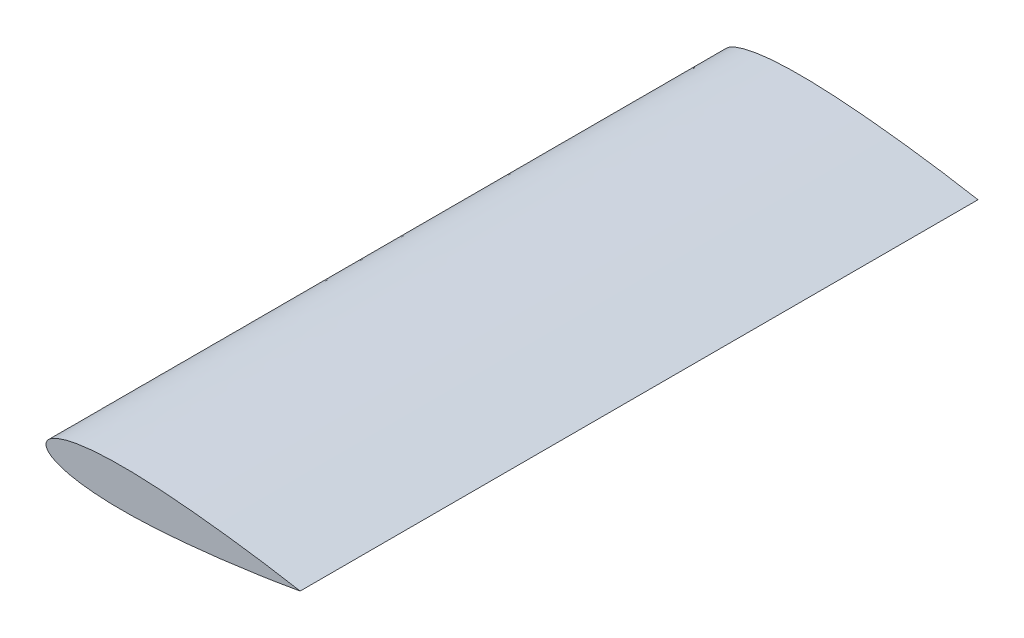
ISO-10303-21;
HEADER;
FILE_DESCRIPTION(('STEP AP214'),'2;1');
FILE_NAME('part.step','',(''),(''),'','','');
FILE_SCHEMA(('AUTOMOTIVE_DESIGN { 1 0 10303 214 1 1 1 1 }'));
ENDSEC;
DATA;
#1=APPLICATION_CONTEXT('core data for automotive mechanical design processes');
#2=APPLICATION_PROTOCOL_DEFINITION('international standard','automotive_design',2000,#1);
#3=PRODUCT_CONTEXT('',#1,'mechanical');
#4=PRODUCT('Part','Part','',(#3));
#5=PRODUCT_RELATED_PRODUCT_CATEGORY('part','',(#4));
#6=PRODUCT_DEFINITION_FORMATION('','',#4);
#7=PRODUCT_DEFINITION_CONTEXT('part definition',#1,'design');
#8=PRODUCT_DEFINITION('design','',#6,#7);
#9=PRODUCT_DEFINITION_SHAPE('','',#8);
#10=(LENGTH_UNIT() NAMED_UNIT(*) SI_UNIT(.MILLI.,.METRE.));
#11=(NAMED_UNIT(*) PLANE_ANGLE_UNIT() SI_UNIT($,.RADIAN.));
#12=(NAMED_UNIT(*) SI_UNIT($,.STERADIAN.) SOLID_ANGLE_UNIT());
#13=UNCERTAINTY_MEASURE_WITH_UNIT(LENGTH_MEASURE(1.E-05),#10,'distance_accuracy_value','');
#14=(GEOMETRIC_REPRESENTATION_CONTEXT(3) GLOBAL_UNCERTAINTY_ASSIGNED_CONTEXT((#13)) GLOBAL_UNIT_ASSIGNED_CONTEXT((#10,
#11,#12)) REPRESENTATION_CONTEXT('',''));
#15=CARTESIAN_POINT('',(0.,0.,0.));
#16=DIRECTION('',(0.,0.,1.));
#17=DIRECTION('',(1.,0.,0.));
#18=AXIS2_PLACEMENT_3D('',#15,#16,#17);
#19=CARTESIAN_POINT('',(300.000000000269,1.12607578833279E-10,800.));
#20=CARTESIAN_POINT('',(299.352388039985,0.117662998146574,800.));
#21=CARTESIAN_POINT('',(298.045922839889,0.353968122962181,800.));
#22=CARTESIAN_POINT('',(294.873159606866,0.924080287624396,800.));
#23=CARTESIAN_POINT('',(290.829335303877,1.6368791122946,800.));
#24=CARTESIAN_POINT('',(285.700780323751,2.5255081323409,800.));
#25=CARTESIAN_POINT('',(280.07274667731,3.47540694785779,800.));
#26=CARTESIAN_POINT('',(274.322933639118,4.42486539836671,800.));
#27=CARTESIAN_POINT('',(267.201727161805,5.57231585220171,800.));
#28=CARTESIAN_POINT('',(258.611446595321,6.91478561137059,800.));
#29=CARTESIAN_POINT('',(248.60545528382,8.41816700856253,800.));
#30=CARTESIAN_POINT('',(238.573919489072,9.85664365545212,800.));
#31=CARTESIAN_POINT('',(229.977619163387,11.040364781274,800.));
#32=CARTESIAN_POINT('',(222.80492151619,11.9958110855832,800.));
#33=CARTESIAN_POINT('',(217.066758989875,12.740467847044,800.));
#34=CARTESIAN_POINT('',(209.889114389432,13.6472673700278,800.));
#35=CARTESIAN_POINT('',(201.27202449345,14.695659938425,800.));
#36=CARTESIAN_POINT('',(191.211031460338,15.8592284181421,800.));
#37=CARTESIAN_POINT('',(179.703344131048,17.1020520630529,800.));
#38=CARTESIAN_POINT('',(165.306340091136,18.5380135722001,800.));
#39=CARTESIAN_POINT('',(148.010279669877,20.0549612984634,800.));
#40=CARTESIAN_POINT('',(130.689546496141,21.2710883818108,800.));
#41=CARTESIAN_POINT('',(113.345884106021,22.1022491428852,800.));
#42=CARTESIAN_POINT('',(95.9889543886649,22.5497392945396,800.));
#43=CARTESIAN_POINT('',(78.6241343193876,22.5521860274201,800.));
#44=CARTESIAN_POINT('',(60.2220436042596,21.8104633580622,800.));
#45=CARTESIAN_POINT('',(41.9741123525132,19.9210003867799,800.));
#46=CARTESIAN_POINT('',(27.8261330314787,17.3001882069213,800.));
#47=CARTESIAN_POINT('',(18.3217085127576,14.6656060490435,800.));
#48=CARTESIAN_POINT('',(11.9898962328555,12.2256294901456,800.));
#49=CARTESIAN_POINT('',(7.90661343111076,10.1418379847888,800.));
#50=CARTESIAN_POINT('',(5.2259085133977,8.37586794735167,800.));
#51=CARTESIAN_POINT('',(3.45683790684532,6.89667524573791,800.));
#52=CARTESIAN_POINT('',(2.26361074439424,5.63966873072461,800.));
#53=CARTESIAN_POINT('',(1.43380635071139,4.5344499551778,800.));
#54=CARTESIAN_POINT('',(0.848421591896912,3.53004769271215,800.));
#55=CARTESIAN_POINT('',(0.448674258375716,2.6089350214112,800.));
#56=CARTESIAN_POINT('',(0.150423201730916,1.61677731479408,800.));
#57=CARTESIAN_POINT('',(0.0309502810930098,0.854000018958829,800.));
#58=CARTESIAN_POINT('',(-9.54887985498755E-05,0.326407864065567,800.));
#59=CARTESIAN_POINT('',(0.,0.,800.));
#60=B_SPLINE_CURVE_WITH_KNOTS('',4,(#19,#20,#21,#22,#23,#24,#25,#26,#27,#28,#29,#30,#31,#32,#33,
#34,#35,#36,#37,#38,#39,#40,#41,#42,#43,#44,#45,#46,#47,#48,#49,#50,#51,#52,#53,#54,#55,#56,#57,
#58,#59),.UNSPECIFIED.,.F.,.F.,(5,1,1,1,1,1,1,1,1,1,1,1,1,1,1,1,1,1,1,1,1,1,1,1,1,1,1,1,1,1,1,1,
1,1,1,1,1,5),(0.,0.00853298322089824,0.0170659664417966,0.0341319328835932,0.0511978993253898,
0.0682638657671863,0.0853298315588374,0.102395797350489,0.136527728933791,0.170659660282332,
0.204791591630873,0.22185755800539,0.238923524379906,0.255989490754423,0.273055457128939,
0.307187388622608,0.341319320116277,0.375451252375729,0.409583184635182,0.477847046872189,
0.54611091008691,0.580242841736857,0.614374773386805,0.682638634417302,0.750902483499631,
0.797371998492183,0.830564432188748,0.852170529566948,0.867075712214191,0.877282595751543,
0.88453613802448,0.889957923219664,0.894218260641381,0.897681880269297,0.900802808591307,
0.903640076326566,0.906034156085366,0.909875099772046),.UNSPECIFIED.);
#61=DIRECTION('',(0.,0.,-1.));
#62=VECTOR('',#61,1.);
#63=SURFACE_OF_LINEAR_EXTRUSION('',#60,#62);
#64=CARTESIAN_POINT('',(300.000000000269,1.12607578833279E-10,0.));
#65=CARTESIAN_POINT('',(299.352388039985,0.117662998146574,0.));
#66=CARTESIAN_POINT('',(298.045922839889,0.353968122962181,0.));
#67=CARTESIAN_POINT('',(294.873159606866,0.924080287624396,0.));
#68=CARTESIAN_POINT('',(290.829335303877,1.6368791122946,0.));
#69=CARTESIAN_POINT('',(285.700780323751,2.5255081323409,0.));
#70=CARTESIAN_POINT('',(280.07274667731,3.47540694785779,0.));
#71=CARTESIAN_POINT('',(274.322933639118,4.42486539836671,0.));
#72=CARTESIAN_POINT('',(267.201727161805,5.57231585220171,0.));
#73=CARTESIAN_POINT('',(258.611446595321,6.91478561137059,0.));
#74=CARTESIAN_POINT('',(248.60545528382,8.41816700856253,0.));
#75=CARTESIAN_POINT('',(238.573919489072,9.85664365545212,0.));
#76=CARTESIAN_POINT('',(229.977619163387,11.040364781274,0.));
#77=CARTESIAN_POINT('',(222.80492151619,11.9958110855832,0.));
#78=CARTESIAN_POINT('',(217.066758989875,12.740467847044,0.));
#79=CARTESIAN_POINT('',(209.889114389432,13.6472673700278,0.));
#80=CARTESIAN_POINT('',(201.27202449345,14.695659938425,0.));
#81=CARTESIAN_POINT('',(191.211031460338,15.8592284181421,0.));
#82=CARTESIAN_POINT('',(179.703344131048,17.1020520630529,0.));
#83=CARTESIAN_POINT('',(165.306340091136,18.5380135722001,0.));
#84=CARTESIAN_POINT('',(148.010279669877,20.0549612984634,0.));
#85=CARTESIAN_POINT('',(130.689546496141,21.2710883818108,0.));
#86=CARTESIAN_POINT('',(113.345884106021,22.1022491428852,0.));
#87=CARTESIAN_POINT('',(95.9889543886649,22.5497392945396,0.));
#88=CARTESIAN_POINT('',(78.6241343193876,22.5521860274201,0.));
#89=CARTESIAN_POINT('',(60.2220436042596,21.8104633580622,0.));
#90=CARTESIAN_POINT('',(41.9741123525132,19.9210003867799,0.));
#91=CARTESIAN_POINT('',(27.8261330314787,17.3001882069213,0.));
#92=CARTESIAN_POINT('',(18.3217085127576,14.6656060490435,0.));
#93=CARTESIAN_POINT('',(11.9898962328555,12.2256294901456,0.));
#94=CARTESIAN_POINT('',(7.90661343111076,10.1418379847888,0.));
#95=CARTESIAN_POINT('',(5.2259085133977,8.37586794735167,0.));
#96=CARTESIAN_POINT('',(3.45683790684532,6.89667524573791,0.));
#97=CARTESIAN_POINT('',(2.26361074439424,5.63966873072461,0.));
#98=CARTESIAN_POINT('',(1.43380635071139,4.5344499551778,0.));
#99=CARTESIAN_POINT('',(0.848421591896912,3.53004769271215,0.));
#100=CARTESIAN_POINT('',(0.448674258375716,2.6089350214112,0.));
#101=CARTESIAN_POINT('',(0.150423201730916,1.61677731479408,0.));
#102=CARTESIAN_POINT('',(0.0309502810930098,0.854000018958829,0.));
#103=CARTESIAN_POINT('',(-9.54887985498755E-05,0.326407864065567,0.));
#104=CARTESIAN_POINT('',(0.,0.,0.));
#105=B_SPLINE_CURVE_WITH_KNOTS('',4,(#64,#65,#66,#67,#68,#69,#70,#71,#72,#73,#74,#75,#76,#77,
#78,#79,#80,#81,#82,#83,#84,#85,#86,#87,#88,#89,#90,#91,#92,#93,#94,#95,#96,#97,#98,#99,#100,
#101,#102,#103,#104),.UNSPECIFIED.,.F.,.F.,(5,1,1,1,1,1,1,1,1,1,1,1,1,1,1,1,1,1,1,1,1,1,1,1,1,1,
1,1,1,1,1,1,1,1,1,1,1,5),(0.,0.00853298322089824,0.0170659664417966,0.0341319328835932,
0.0511978993253898,0.0682638657671863,0.0853298315588374,0.102395797350489,0.136527728933791,
0.170659660282332,0.204791591630873,0.22185755800539,0.238923524379906,0.255989490754423,
0.273055457128939,0.307187388622608,0.341319320116277,0.375451252375729,0.409583184635182,
0.477847046872189,0.54611091008691,0.580242841736857,0.614374773386805,0.682638634417302,
0.750902483499631,0.797371998492183,0.830564432188748,0.852170529566948,0.867075712214191,
0.877282595751543,0.88453613802448,0.889957923219664,0.894218260641381,0.897681880269297,
0.900802808591307,0.903640076326566,0.906034156085366,0.909875099772046),.UNSPECIFIED.);
#106=CARTESIAN_POINT('',(300.000000000659,1.19655924677673E-10,0.));
#107=VERTEX_POINT('',#106);
#108=CARTESIAN_POINT('',(0.,0.,0.));
#109=VERTEX_POINT('',#108);
#110=EDGE_CURVE('E66',#107,#109,#105,.T.);
#111=ORIENTED_EDGE('',*,*,#110,.T.);
#112=DIRECTION('',(0.,0.,-1.));
#113=VECTOR('',#112,1.);
#114=CARTESIAN_POINT('',(0.,0.,800.));
#115=LINE('',#114,#113);
#116=CARTESIAN_POINT('',(0.,0.,800.));
#117=VERTEX_POINT('',#116);
#118=EDGE_CURVE('E11',#117,#109,#115,.T.);
#119=ORIENTED_EDGE('',*,*,#118,.F.);
#120=CARTESIAN_POINT('',(300.000000000659,1.19655924677673E-10,800.));
#121=VERTEX_POINT('',#120);
#122=EDGE_CURVE('E65',#121,#117,#60,.T.);
#123=ORIENTED_EDGE('',*,*,#122,.F.);
#124=DIRECTION('',(0.,0.,-1.));
#125=VECTOR('',#124,1.);
#126=CARTESIAN_POINT('',(300.000000000659,1.19655924677673E-10,800.));
#127=LINE('',#126,#125);
#128=EDGE_CURVE('E43',#121,#107,#127,.T.);
#129=ORIENTED_EDGE('',*,*,#128,.T.);
#130=EDGE_LOOP('',(#111,#119,#123,#129));
#131=FACE_BOUND('',#130,.T.);
#132=ADVANCED_FACE('F34',(#131),#63,.F.);
#133=CARTESIAN_POINT('',(0.,0.,800.));
#134=CARTESIAN_POINT('',(-9.54887983742186E-05,-0.326407864065569,800.));
#135=CARTESIAN_POINT('',(0.0309502810934694,-0.854000018958814,800.));
#136=CARTESIAN_POINT('',(0.150423201731786,-1.616777314794,800.));
#137=CARTESIAN_POINT('',(0.44867425837712,-2.60893502141096,800.));
#138=CARTESIAN_POINT('',(0.848421591898812,-3.53004769271169,800.));
#139=CARTESIAN_POINT('',(1.43380635071383,-4.53444995517703,800.));
#140=CARTESIAN_POINT('',(2.26361074439728,-5.63966873072339,800.));
#141=CARTESIAN_POINT('',(3.45683790684903,-6.89667524573605,800.));
#142=CARTESIAN_POINT('',(5.2259085134022,-8.37586794734886,800.));
#143=CARTESIAN_POINT('',(7.90661343111622,-10.1418379847846,800.));
#144=CARTESIAN_POINT('',(11.9898962328621,-12.2256294901392,800.));
#145=CARTESIAN_POINT('',(18.3217085127655,-14.6656060490336,800.));
#146=CARTESIAN_POINT('',(27.826133031488,-17.3001882069064,800.));
#147=CARTESIAN_POINT('',(41.9741123525239,-19.9210003867574,800.));
#148=CARTESIAN_POINT('',(60.2220436042713,-21.8104633580298,800.));
#149=CARTESIAN_POINT('',(78.6241343193997,-22.5521860273778,800.));
#150=CARTESIAN_POINT('',(95.988954388677,-22.5497392944879,800.));
#151=CARTESIAN_POINT('',(113.345884106033,-22.1022491428242,800.));
#152=CARTESIAN_POINT('',(130.689546496152,-21.2710883817405,800.));
#153=CARTESIAN_POINT('',(148.010279669888,-20.0549612983837,800.));
#154=CARTESIAN_POINT('',(165.306340091146,-18.5380135721112,800.));
#155=CARTESIAN_POINT('',(179.703344131058,-17.1020520629562,800.));
#156=CARTESIAN_POINT('',(191.211031460346,-15.8592284180392,800.));
#157=CARTESIAN_POINT('',(201.272024493458,-14.6956599383167,800.));
#158=CARTESIAN_POINT('',(209.889114389439,-13.6472673699148,800.));
#159=CARTESIAN_POINT('',(217.066758989882,-12.7404678469272,800.));
#160=CARTESIAN_POINT('',(222.804921516196,-11.9958110854633,800.));
#161=CARTESIAN_POINT('',(229.977619163393,-11.0403647811503,800.));
#162=CARTESIAN_POINT('',(238.573919489077,-9.85664365532374,800.));
#163=CARTESIAN_POINT('',(248.605455283825,-8.41816700842874,800.));
#164=CARTESIAN_POINT('',(258.611446595324,-6.91478561123142,800.));
#165=CARTESIAN_POINT('',(267.201727161807,-5.57231585205792,800.));
#166=CARTESIAN_POINT('',(274.322933639121,-4.42486539821909,800.));
#167=CARTESIAN_POINT('',(280.072746677311,-3.47540694770707,800.));
#168=CARTESIAN_POINT('',(285.700780323753,-2.52550813218715,800.));
#169=CARTESIAN_POINT('',(290.829335303878,-1.63687911213809,800.));
#170=CARTESIAN_POINT('',(294.873159606968,-0.924080287447835,800.));
#171=CARTESIAN_POINT('',(298.045922840127,-0.353968122758896,800.));
#172=CARTESIAN_POINT('',(299.352388040279,-0.117662997932143,800.));
#173=CARTESIAN_POINT('',(300.000000000659,1.19655924677673E-10,800.));
#174=B_SPLINE_CURVE_WITH_KNOTS('',4,(#133,#134,#135,#136,#137,#138,#139,#140,#141,#142,#143,
#144,#145,#146,#147,#148,#149,#150,#151,#152,#153,#154,#155,#156,#157,#158,#159,#160,#161,#162,
#163,#164,#165,#166,#167,#168,#169,#170,#171,#172,#173),.UNSPECIFIED.,.F.,.F.,(5,1,1,1,1,1,1,1,
1,1,1,1,1,1,1,1,1,1,1,1,1,1,1,1,1,1,1,1,1,1,1,1,1,1,1,1,1,5),(0.,0.0038409436866803,
0.00623502344547993,0.00907229118073891,0.0121932195027496,0.0156568391306655,
0.0199171765523819,0.0253389617475659,0.0325925040205036,0.0427993875578547,0.057704570205098,
0.0793106675832982,0.112503101279863,0.158972616272415,0.227236465354745,0.295500326385241,
0.329632258035189,0.363764189685136,0.432028052899857,0.500291915136864,0.534423847396317,
0.56855577965577,0.602687711149438,0.636819642643107,0.653885609017623,0.67095157539214,
0.688017541766657,0.705083508141173,0.739215439489714,0.773347370838255,0.807479302421558,
0.824545268213209,0.84161123400486,0.858677200446656,0.875743166888453,0.89280913333025,
0.901342116551148,0.909875099772046),.UNSPECIFIED.);
#175=DIRECTION('',(0.,0.,-1.));
#176=VECTOR('',#175,1.);
#177=SURFACE_OF_LINEAR_EXTRUSION('',#174,#176);
#178=CARTESIAN_POINT('',(0.,0.,0.));
#179=CARTESIAN_POINT('',(-9.54887983742186E-05,-0.326407864065569,0.));
#180=CARTESIAN_POINT('',(0.0309502810934694,-0.854000018958814,0.));
#181=CARTESIAN_POINT('',(0.150423201731786,-1.616777314794,0.));
#182=CARTESIAN_POINT('',(0.44867425837712,-2.60893502141096,0.));
#183=CARTESIAN_POINT('',(0.848421591898812,-3.53004769271169,0.));
#184=CARTESIAN_POINT('',(1.43380635071383,-4.53444995517703,0.));
#185=CARTESIAN_POINT('',(2.26361074439728,-5.63966873072339,0.));
#186=CARTESIAN_POINT('',(3.45683790684903,-6.89667524573605,0.));
#187=CARTESIAN_POINT('',(5.2259085134022,-8.37586794734886,0.));
#188=CARTESIAN_POINT('',(7.90661343111622,-10.1418379847846,0.));
#189=CARTESIAN_POINT('',(11.9898962328621,-12.2256294901392,0.));
#190=CARTESIAN_POINT('',(18.3217085127655,-14.6656060490336,0.));
#191=CARTESIAN_POINT('',(27.826133031488,-17.3001882069064,0.));
#192=CARTESIAN_POINT('',(41.9741123525239,-19.9210003867574,0.));
#193=CARTESIAN_POINT('',(60.2220436042713,-21.8104633580298,0.));
#194=CARTESIAN_POINT('',(78.6241343193997,-22.5521860273778,0.));
#195=CARTESIAN_POINT('',(95.988954388677,-22.5497392944879,0.));
#196=CARTESIAN_POINT('',(113.345884106033,-22.1022491428242,0.));
#197=CARTESIAN_POINT('',(130.689546496152,-21.2710883817405,0.));
#198=CARTESIAN_POINT('',(148.010279669888,-20.0549612983837,0.));
#199=CARTESIAN_POINT('',(165.306340091146,-18.5380135721112,0.));
#200=CARTESIAN_POINT('',(179.703344131058,-17.1020520629562,0.));
#201=CARTESIAN_POINT('',(191.211031460346,-15.8592284180392,0.));
#202=CARTESIAN_POINT('',(201.272024493458,-14.6956599383167,0.));
#203=CARTESIAN_POINT('',(209.889114389439,-13.6472673699148,0.));
#204=CARTESIAN_POINT('',(217.066758989882,-12.7404678469272,0.));
#205=CARTESIAN_POINT('',(222.804921516196,-11.9958110854633,0.));
#206=CARTESIAN_POINT('',(229.977619163393,-11.0403647811503,0.));
#207=CARTESIAN_POINT('',(238.573919489077,-9.85664365532374,0.));
#208=CARTESIAN_POINT('',(248.605455283825,-8.41816700842874,0.));
#209=CARTESIAN_POINT('',(258.611446595324,-6.91478561123142,0.));
#210=CARTESIAN_POINT('',(267.201727161807,-5.57231585205792,0.));
#211=CARTESIAN_POINT('',(274.322933639121,-4.42486539821909,0.));
#212=CARTESIAN_POINT('',(280.072746677311,-3.47540694770707,0.));
#213=CARTESIAN_POINT('',(285.700780323753,-2.52550813218715,0.));
#214=CARTESIAN_POINT('',(290.829335303878,-1.63687911213809,0.));
#215=CARTESIAN_POINT('',(294.873159606968,-0.924080287447835,0.));
#216=CARTESIAN_POINT('',(298.045922840127,-0.353968122758896,0.));
#217=CARTESIAN_POINT('',(299.352388040279,-0.117662997932143,0.));
#218=CARTESIAN_POINT('',(300.000000000659,1.19655924677673E-10,0.));
#219=B_SPLINE_CURVE_WITH_KNOTS('',4,(#178,#179,#180,#181,#182,#183,#184,#185,#186,#187,#188,
#189,#190,#191,#192,#193,#194,#195,#196,#197,#198,#199,#200,#201,#202,#203,#204,#205,#206,#207,
#208,#209,#210,#211,#212,#213,#214,#215,#216,#217,#218),.UNSPECIFIED.,.F.,.F.,(5,1,1,1,1,1,1,1,
1,1,1,1,1,1,1,1,1,1,1,1,1,1,1,1,1,1,1,1,1,1,1,1,1,1,1,1,1,5),(0.,0.0038409436866803,
0.00623502344547993,0.00907229118073891,0.0121932195027496,0.0156568391306655,
0.0199171765523819,0.0253389617475659,0.0325925040205036,0.0427993875578547,0.057704570205098,
0.0793106675832982,0.112503101279863,0.158972616272415,0.227236465354745,0.295500326385241,
0.329632258035189,0.363764189685136,0.432028052899857,0.500291915136864,0.534423847396317,
0.56855577965577,0.602687711149438,0.636819642643107,0.653885609017623,0.67095157539214,
0.688017541766657,0.705083508141173,0.739215439489714,0.773347370838255,0.807479302421558,
0.824545268213209,0.84161123400486,0.858677200446656,0.875743166888453,0.89280913333025,
0.901342116551148,0.909875099772046),.UNSPECIFIED.);
#220=EDGE_CURVE('E58',#109,#107,#219,.T.);
#221=ORIENTED_EDGE('',*,*,#220,.T.);
#222=ORIENTED_EDGE('',*,*,#128,.F.);
#223=EDGE_CURVE('E50',#117,#121,#174,.T.);
#224=ORIENTED_EDGE('',*,*,#223,.F.);
#225=ORIENTED_EDGE('',*,*,#118,.T.);
#226=EDGE_LOOP('',(#221,#222,#224,#225));
#227=FACE_BOUND('',#226,.T.);
#228=ADVANCED_FACE('F61',(#227),#177,.F.);
#229=CARTESIAN_POINT('',(147.094922776459,20.0505862727969,800.));
#230=DIRECTION('',(0.,0.,1.));
#231=DIRECTION('',(1.,0.,0.));
#232=AXIS2_PLACEMENT_3D('',#229,#230,#231);
#233=PLANE('',#232);
#234=ORIENTED_EDGE('',*,*,#122,.T.);
#235=ORIENTED_EDGE('',*,*,#223,.T.);
#236=EDGE_LOOP('',(#234,#235));
#237=FACE_BOUND('',#236,.T.);
#238=ADVANCED_FACE('F93',(#237),#233,.T.);
#239=CARTESIAN_POINT('',(147.094922776459,20.0505862727969,0.));
#240=DIRECTION('',(0.,0.,1.));
#241=DIRECTION('',(1.,0.,0.));
#242=AXIS2_PLACEMENT_3D('',#239,#240,#241);
#243=PLANE('',#242);
#244=ORIENTED_EDGE('',*,*,#110,.F.);
#245=ORIENTED_EDGE('',*,*,#220,.F.);
#246=EDGE_LOOP('',(#244,#245));
#247=FACE_BOUND('',#246,.T.);
#248=ADVANCED_FACE('F69',(#247),#243,.F.);
#249=CLOSED_SHELL('',(#132,#228,#238,#248));
#250=MANIFOLD_SOLID_BREP('B2',#249);
#251=ADVANCED_BREP_SHAPE_REPRESENTATION('',(#18,#250),#14);
#252=SHAPE_DEFINITION_REPRESENTATION(#9,#251);
ENDSEC;
END-ISO-10303-21;
